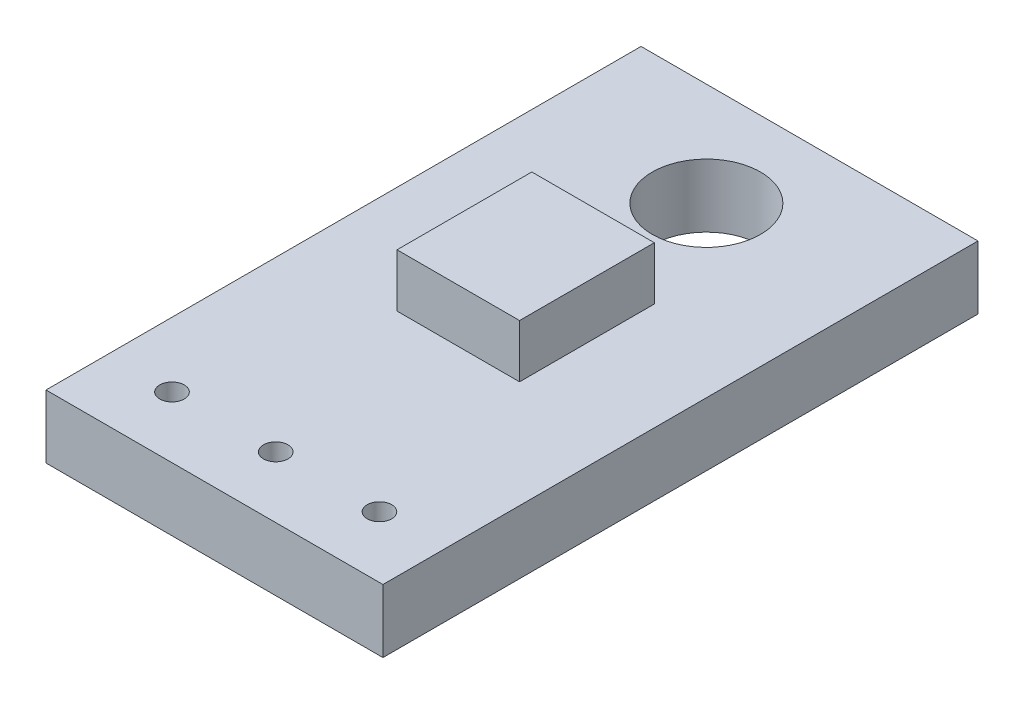
ISO-10303-21;
HEADER;
FILE_DESCRIPTION(('STEP AP214'),'2;1');
FILE_NAME('part.step','',(''),(''),'','','');
FILE_SCHEMA(('AUTOMOTIVE_DESIGN { 1 0 10303 214 1 1 1 1 }'));
ENDSEC;
DATA;
#1=APPLICATION_CONTEXT('core data for automotive mechanical design processes');
#2=APPLICATION_PROTOCOL_DEFINITION('international standard','automotive_design',2000,#1);
#3=PRODUCT_CONTEXT('',#1,'mechanical');
#4=PRODUCT('Part','Part','',(#3));
#5=PRODUCT_RELATED_PRODUCT_CATEGORY('part','',(#4));
#6=PRODUCT_DEFINITION_FORMATION('','',#4);
#7=PRODUCT_DEFINITION_CONTEXT('part definition',#1,'design');
#8=PRODUCT_DEFINITION('design','',#6,#7);
#9=PRODUCT_DEFINITION_SHAPE('','',#8);
#10=(LENGTH_UNIT() NAMED_UNIT(*) SI_UNIT(.MILLI.,.METRE.));
#11=(NAMED_UNIT(*) PLANE_ANGLE_UNIT() SI_UNIT($,.RADIAN.));
#12=(NAMED_UNIT(*) SI_UNIT($,.STERADIAN.) SOLID_ANGLE_UNIT());
#13=UNCERTAINTY_MEASURE_WITH_UNIT(LENGTH_MEASURE(1.E-05),#10,'distance_accuracy_value','');
#14=(GEOMETRIC_REPRESENTATION_CONTEXT(3) GLOBAL_UNCERTAINTY_ASSIGNED_CONTEXT((#13)) GLOBAL_UNIT_ASSIGNED_CONTEXT((#10,
#11,#12)) REPRESENTATION_CONTEXT('',''));
#15=CARTESIAN_POINT('',(0.,0.,0.));
#16=DIRECTION('',(0.,0.,1.));
#17=DIRECTION('',(1.,0.,0.));
#18=AXIS2_PLACEMENT_3D('',#15,#16,#17);
#19=CARTESIAN_POINT('',(0.,1.55,0.));
#20=DIRECTION('',(0.,-1.,0.));
#21=DIRECTION('',(0.,0.,-1.));
#22=AXIS2_PLACEMENT_3D('',#19,#20,#21);
#23=PLANE('',#22);
#24=CARTESIAN_POINT('',(4.125,1.55,-1.5));
#25=DIRECTION('',(0.,1.,0.));
#26=DIRECTION('',(0.,0.,1.));
#27=AXIS2_PLACEMENT_3D('',#24,#25,#26);
#28=CIRCLE('',#27,0.3);
#29=CARTESIAN_POINT('',(4.125,1.55,-1.2));
#30=VERTEX_POINT('',#29);
#31=EDGE_CURVE('E313',#30,#30,#28,.T.);
#32=ORIENTED_EDGE('',*,*,#31,.F.);
#33=EDGE_LOOP('',(#32));
#34=FACE_BOUND('',#33,.T.);
#35=CARTESIAN_POINT('',(1.585,1.55,-1.5));
#36=DIRECTION('',(0.,1.,0.));
#37=DIRECTION('',(0.,0.,1.));
#38=AXIS2_PLACEMENT_3D('',#35,#36,#37);
#39=CIRCLE('',#38,0.3);
#40=CARTESIAN_POINT('',(1.585,1.55,-1.2));
#41=VERTEX_POINT('',#40);
#42=EDGE_CURVE('E315',#41,#41,#39,.T.);
#43=ORIENTED_EDGE('',*,*,#42,.F.);
#44=EDGE_LOOP('',(#43));
#45=FACE_BOUND('',#44,.T.);
#46=CARTESIAN_POINT('',(6.665,1.55,-1.5));
#47=DIRECTION('',(0.,1.,0.));
#48=DIRECTION('',(0.,0.,1.));
#49=AXIS2_PLACEMENT_3D('',#46,#47,#48);
#50=CIRCLE('',#49,0.3);
#51=CARTESIAN_POINT('',(6.665,1.55,-1.2));
#52=VERTEX_POINT('',#51);
#53=EDGE_CURVE('E323',#52,#52,#50,.T.);
#54=ORIENTED_EDGE('',*,*,#53,.F.);
#55=EDGE_LOOP('',(#54));
#56=FACE_BOUND('',#55,.T.);
#57=DIRECTION('',(0.,0.,1.));
#58=VECTOR('',#57,1.);
#59=CARTESIAN_POINT('',(0.,1.55,0.));
#60=LINE('',#59,#58);
#61=CARTESIAN_POINT('',(0.,1.55,-14.57));
#62=VERTEX_POINT('',#61);
#63=CARTESIAN_POINT('',(0.,1.55,0.));
#64=VERTEX_POINT('',#63);
#65=EDGE_CURVE('E130',#62,#64,#60,.T.);
#66=ORIENTED_EDGE('',*,*,#65,.T.);
#67=DIRECTION('',(1.,0.,0.));
#68=VECTOR('',#67,1.);
#69=CARTESIAN_POINT('',(0.,1.55,0.));
#70=LINE('',#69,#68);
#71=CARTESIAN_POINT('',(8.25,1.55,0.));
#72=VERTEX_POINT('',#71);
#73=EDGE_CURVE('E133',#64,#72,#70,.T.);
#74=ORIENTED_EDGE('',*,*,#73,.T.);
#75=DIRECTION('',(0.,0.,-1.));
#76=VECTOR('',#75,1.);
#77=CARTESIAN_POINT('',(8.25,1.55,0.));
#78=LINE('',#77,#76);
#79=CARTESIAN_POINT('',(8.25,1.55,-14.57));
#80=VERTEX_POINT('',#79);
#81=EDGE_CURVE('E136',#72,#80,#78,.T.);
#82=ORIENTED_EDGE('',*,*,#81,.T.);
#83=DIRECTION('',(-1.,0.,0.));
#84=VECTOR('',#83,1.);
#85=CARTESIAN_POINT('',(0.,1.55,-14.57));
#86=LINE('',#85,#84);
#87=EDGE_CURVE('E138',#80,#62,#86,.T.);
#88=ORIENTED_EDGE('',*,*,#87,.T.);
#89=EDGE_LOOP('',(#66,#74,#82,#88));
#90=FACE_BOUND('',#89,.T.);
#91=CARTESIAN_POINT('',(4.125,1.55,-12.045));
#92=DIRECTION('',(0.,1.,0.));
#93=DIRECTION('',(0.,0.,1.));
#94=AXIS2_PLACEMENT_3D('',#91,#92,#93);
#95=CIRCLE('',#94,1.325);
#96=CARTESIAN_POINT('',(4.125,1.55,-10.72));
#97=VERTEX_POINT('',#96);
#98=EDGE_CURVE('E118',#97,#97,#95,.T.);
#99=ORIENTED_EDGE('',*,*,#98,.F.);
#100=EDGE_LOOP('',(#99));
#101=FACE_BOUND('',#100,.T.);
#102=DIRECTION('',(0.,0.,1.));
#103=VECTOR('',#102,1.);
#104=CARTESIAN_POINT('',(2.625,1.55,-9.27));
#105=LINE('',#104,#103);
#106=CARTESIAN_POINT('',(2.625,1.55,-9.27));
#107=VERTEX_POINT('',#106);
#108=CARTESIAN_POINT('',(2.625,1.55,-5.97));
#109=VERTEX_POINT('',#108);
#110=EDGE_CURVE('E117',#107,#109,#105,.T.);
#111=ORIENTED_EDGE('',*,*,#110,.F.);
#112=DIRECTION('',(-1.,0.,0.));
#113=VECTOR('',#112,1.);
#114=CARTESIAN_POINT('',(2.625,1.55,-9.27));
#115=LINE('',#114,#113);
#116=CARTESIAN_POINT('',(5.625,1.55,-9.27));
#117=VERTEX_POINT('',#116);
#118=EDGE_CURVE('E114',#117,#107,#115,.T.);
#119=ORIENTED_EDGE('',*,*,#118,.F.);
#120=DIRECTION('',(0.,0.,-1.));
#121=VECTOR('',#120,1.);
#122=CARTESIAN_POINT('',(5.625,1.55,-9.27));
#123=LINE('',#122,#121);
#124=CARTESIAN_POINT('',(5.625,1.55,-5.97));
#125=VERTEX_POINT('',#124);
#126=EDGE_CURVE('E52',#125,#117,#123,.T.);
#127=ORIENTED_EDGE('',*,*,#126,.F.);
#128=DIRECTION('',(1.,0.,0.));
#129=VECTOR('',#128,1.);
#130=CARTESIAN_POINT('',(2.625,1.55,-5.97));
#131=LINE('',#130,#129);
#132=EDGE_CURVE('E47',#109,#125,#131,.T.);
#133=ORIENTED_EDGE('',*,*,#132,.F.);
#134=EDGE_LOOP('',(#111,#119,#127,#133));
#135=FACE_BOUND('',#134,.T.);
#136=ADVANCED_FACE('F32',(#34,#45,#56,#90,#101,#135),#23,.F.);
#137=CARTESIAN_POINT('',(0.,1.55,0.));
#138=DIRECTION('',(1.,0.,0.));
#139=DIRECTION('',(0.,0.,-1.));
#140=AXIS2_PLACEMENT_3D('',#137,#138,#139);
#141=PLANE('',#140);
#142=DIRECTION('',(0.,0.,1.));
#143=VECTOR('',#142,1.);
#144=CARTESIAN_POINT('',(0.,0.,0.));
#145=LINE('',#144,#143);
#146=CARTESIAN_POINT('',(0.,0.,-14.57));
#147=VERTEX_POINT('',#146);
#148=CARTESIAN_POINT('',(0.,0.,0.));
#149=VERTEX_POINT('',#148);
#150=EDGE_CURVE('E128',#147,#149,#145,.T.);
#151=ORIENTED_EDGE('',*,*,#150,.T.);
#152=DIRECTION('',(0.,-1.,0.));
#153=VECTOR('',#152,1.);
#154=CARTESIAN_POINT('',(0.,1.55,0.));
#155=LINE('',#154,#153);
#156=EDGE_CURVE('E11',#64,#149,#155,.T.);
#157=ORIENTED_EDGE('',*,*,#156,.F.);
#158=ORIENTED_EDGE('',*,*,#65,.F.);
#159=DIRECTION('',(0.,-1.,0.));
#160=VECTOR('',#159,1.);
#161=CARTESIAN_POINT('',(0.,1.55,-14.57));
#162=LINE('',#161,#160);
#163=EDGE_CURVE('E140',#62,#147,#162,.T.);
#164=ORIENTED_EDGE('',*,*,#163,.T.);
#165=EDGE_LOOP('',(#151,#157,#158,#164));
#166=FACE_BOUND('',#165,.T.);
#167=ADVANCED_FACE('F34',(#166),#141,.F.);
#168=CARTESIAN_POINT('',(0.,1.55,0.));
#169=DIRECTION('',(0.,0.,-1.));
#170=DIRECTION('',(-1.,0.,0.));
#171=AXIS2_PLACEMENT_3D('',#168,#169,#170);
#172=PLANE('',#171);
#173=DIRECTION('',(1.,0.,0.));
#174=VECTOR('',#173,1.);
#175=CARTESIAN_POINT('',(0.,0.,0.));
#176=LINE('',#175,#174);
#177=CARTESIAN_POINT('',(8.25,0.,0.));
#178=VERTEX_POINT('',#177);
#179=EDGE_CURVE('E143',#149,#178,#176,.T.);
#180=ORIENTED_EDGE('',*,*,#179,.T.);
#181=DIRECTION('',(0.,-1.,0.));
#182=VECTOR('',#181,1.);
#183=CARTESIAN_POINT('',(8.25,1.55,0.));
#184=LINE('',#183,#182);
#185=EDGE_CURVE('E40',#72,#178,#184,.T.);
#186=ORIENTED_EDGE('',*,*,#185,.F.);
#187=ORIENTED_EDGE('',*,*,#73,.F.);
#188=ORIENTED_EDGE('',*,*,#156,.T.);
#189=EDGE_LOOP('',(#180,#186,#187,#188));
#190=FACE_BOUND('',#189,.T.);
#191=ADVANCED_FACE('F173',(#190),#172,.F.);
#192=CARTESIAN_POINT('',(8.25,1.55,0.));
#193=DIRECTION('',(-1.,0.,0.));
#194=DIRECTION('',(0.,0.,1.));
#195=AXIS2_PLACEMENT_3D('',#192,#193,#194);
#196=PLANE('',#195);
#197=DIRECTION('',(0.,0.,-1.));
#198=VECTOR('',#197,1.);
#199=CARTESIAN_POINT('',(8.25,0.,0.));
#200=LINE('',#199,#198);
#201=CARTESIAN_POINT('',(8.25,0.,-14.57));
#202=VERTEX_POINT('',#201);
#203=EDGE_CURVE('E145',#178,#202,#200,.T.);
#204=ORIENTED_EDGE('',*,*,#203,.T.);
#205=DIRECTION('',(0.,-1.,0.));
#206=VECTOR('',#205,1.);
#207=CARTESIAN_POINT('',(8.25,1.55,-14.57));
#208=LINE('',#207,#206);
#209=EDGE_CURVE('E150',#80,#202,#208,.T.);
#210=ORIENTED_EDGE('',*,*,#209,.F.);
#211=ORIENTED_EDGE('',*,*,#81,.F.);
#212=ORIENTED_EDGE('',*,*,#185,.T.);
#213=EDGE_LOOP('',(#204,#210,#211,#212));
#214=FACE_BOUND('',#213,.T.);
#215=ADVANCED_FACE('F157',(#214),#196,.F.);
#216=CARTESIAN_POINT('',(0.,1.55,-14.57));
#217=DIRECTION('',(0.,0.,1.));
#218=DIRECTION('',(1.,0.,0.));
#219=AXIS2_PLACEMENT_3D('',#216,#217,#218);
#220=PLANE('',#219);
#221=DIRECTION('',(-1.,0.,0.));
#222=VECTOR('',#221,1.);
#223=CARTESIAN_POINT('',(0.,0.,-14.57));
#224=LINE('',#223,#222);
#225=EDGE_CURVE('E134',#202,#147,#224,.T.);
#226=ORIENTED_EDGE('',*,*,#225,.T.);
#227=ORIENTED_EDGE('',*,*,#163,.F.);
#228=ORIENTED_EDGE('',*,*,#87,.F.);
#229=ORIENTED_EDGE('',*,*,#209,.T.);
#230=EDGE_LOOP('',(#226,#227,#228,#229));
#231=FACE_BOUND('',#230,.T.);
#232=ADVANCED_FACE('F166',(#231),#220,.F.);
#233=CARTESIAN_POINT('',(0.,0.,0.));
#234=DIRECTION('',(0.,-1.,0.));
#235=DIRECTION('',(0.,0.,-1.));
#236=AXIS2_PLACEMENT_3D('',#233,#234,#235);
#237=PLANE('',#236);
#238=CARTESIAN_POINT('',(4.125,0.,-1.5));
#239=DIRECTION('',(0.,-1.,0.));
#240=DIRECTION('',(0.,0.,-1.));
#241=AXIS2_PLACEMENT_3D('',#238,#239,#240);
#242=CIRCLE('',#241,0.299999999999999);
#243=CARTESIAN_POINT('',(4.125,0.,-1.8));
#244=VERTEX_POINT('',#243);
#245=EDGE_CURVE('E311',#244,#244,#242,.T.);
#246=ORIENTED_EDGE('',*,*,#245,.F.);
#247=EDGE_LOOP('',(#246));
#248=FACE_BOUND('',#247,.T.);
#249=CARTESIAN_POINT('',(1.585,0.,-1.5));
#250=DIRECTION('',(0.,-1.,0.));
#251=DIRECTION('',(0.,0.,-1.));
#252=AXIS2_PLACEMENT_3D('',#249,#250,#251);
#253=CIRCLE('',#252,0.3);
#254=CARTESIAN_POINT('',(1.585,0.,-1.8));
#255=VERTEX_POINT('',#254);
#256=EDGE_CURVE('E320',#255,#255,#253,.T.);
#257=ORIENTED_EDGE('',*,*,#256,.F.);
#258=EDGE_LOOP('',(#257));
#259=FACE_BOUND('',#258,.T.);
#260=CARTESIAN_POINT('',(6.665,0.,-1.5));
#261=DIRECTION('',(0.,-1.,0.));
#262=DIRECTION('',(0.,0.,-1.));
#263=AXIS2_PLACEMENT_3D('',#260,#261,#262);
#264=CIRCLE('',#263,0.3);
#265=CARTESIAN_POINT('',(6.665,0.,-1.8));
#266=VERTEX_POINT('',#265);
#267=EDGE_CURVE('E326',#266,#266,#264,.T.);
#268=ORIENTED_EDGE('',*,*,#267,.F.);
#269=EDGE_LOOP('',(#268));
#270=FACE_BOUND('',#269,.T.);
#271=CARTESIAN_POINT('',(4.125,0.,-12.045));
#272=DIRECTION('',(0.,1.,0.));
#273=DIRECTION('',(0.,0.,1.));
#274=AXIS2_PLACEMENT_3D('',#271,#272,#273);
#275=CIRCLE('',#274,1.325);
#276=CARTESIAN_POINT('',(4.125,0.,-10.72));
#277=VERTEX_POINT('',#276);
#278=EDGE_CURVE('E121',#277,#277,#275,.T.);
#279=ORIENTED_EDGE('',*,*,#278,.T.);
#280=EDGE_LOOP('',(#279));
#281=FACE_BOUND('',#280,.T.);
#282=ORIENTED_EDGE('',*,*,#150,.F.);
#283=ORIENTED_EDGE('',*,*,#225,.F.);
#284=ORIENTED_EDGE('',*,*,#203,.F.);
#285=ORIENTED_EDGE('',*,*,#179,.F.);
#286=EDGE_LOOP('',(#282,#283,#284,#285));
#287=FACE_BOUND('',#286,.T.);
#288=ADVANCED_FACE('F163',(#248,#259,#270,#281,#287),#237,.T.);
#289=CARTESIAN_POINT('',(4.125,0.,-12.045));
#290=DIRECTION('',(0.,1.,0.));
#291=DIRECTION('',(0.,0.,1.));
#292=AXIS2_PLACEMENT_3D('',#289,#290,#291);
#293=CYLINDRICAL_SURFACE('',#292,1.325);
#294=CARTESIAN_POINT('',(4.125,0.,-10.72));
#295=CARTESIAN_POINT('',(4.125,0.0161458333333333,-10.72));
#296=CARTESIAN_POINT('',(4.125,0.0322916666666667,-10.72));
#297=CARTESIAN_POINT('',(4.125,0.0645833333333333,-10.72));
#298=CARTESIAN_POINT('',(4.125,0.0807291666666667,-10.72));
#299=CARTESIAN_POINT('',(4.125,0.113020833333333,-10.72));
#300=CARTESIAN_POINT('',(4.125,0.129166666666667,-10.72));
#301=CARTESIAN_POINT('',(4.125,0.161458333333333,-10.72));
#302=CARTESIAN_POINT('',(4.125,0.177604166666667,-10.72));
#303=CARTESIAN_POINT('',(4.125,0.209895833333333,-10.72));
#304=CARTESIAN_POINT('',(4.125,0.226041666666667,-10.72));
#305=CARTESIAN_POINT('',(4.125,0.258333333333333,-10.72));
#306=CARTESIAN_POINT('',(4.125,0.274479166666667,-10.72));
#307=CARTESIAN_POINT('',(4.125,0.306770833333333,-10.72));
#308=CARTESIAN_POINT('',(4.125,0.322916666666667,-10.72));
#309=CARTESIAN_POINT('',(4.125,0.355208333333333,-10.72));
#310=CARTESIAN_POINT('',(4.125,0.371354166666667,-10.72));
#311=CARTESIAN_POINT('',(4.125,0.403645833333333,-10.72));
#312=CARTESIAN_POINT('',(4.125,0.419791666666667,-10.72));
#313=CARTESIAN_POINT('',(4.125,0.452083333333333,-10.72));
#314=CARTESIAN_POINT('',(4.125,0.468229166666667,-10.72));
#315=CARTESIAN_POINT('',(4.125,0.500520833333333,-10.72));
#316=CARTESIAN_POINT('',(4.125,0.516666666666667,-10.72));
#317=CARTESIAN_POINT('',(4.125,0.548958333333333,-10.72));
#318=CARTESIAN_POINT('',(4.125,0.565104166666667,-10.72));
#319=CARTESIAN_POINT('',(4.125,0.597395833333333,-10.72));
#320=CARTESIAN_POINT('',(4.125,0.613541666666667,-10.72));
#321=CARTESIAN_POINT('',(4.125,0.645833333333333,-10.72));
#322=CARTESIAN_POINT('',(4.125,0.661979166666667,-10.72));
#323=CARTESIAN_POINT('',(4.125,0.694270833333333,-10.72));
#324=CARTESIAN_POINT('',(4.125,0.710416666666667,-10.72));
#325=CARTESIAN_POINT('',(4.125,0.742708333333333,-10.72));
#326=CARTESIAN_POINT('',(4.125,0.758854166666667,-10.72));
#327=CARTESIAN_POINT('',(4.125,0.791145833333333,-10.72));
#328=CARTESIAN_POINT('',(4.125,0.807291666666667,-10.72));
#329=CARTESIAN_POINT('',(4.125,0.839583333333333,-10.72));
#330=CARTESIAN_POINT('',(4.125,0.855729166666667,-10.72));
#331=CARTESIAN_POINT('',(4.125,0.888020833333333,-10.72));
#332=CARTESIAN_POINT('',(4.125,0.904166666666667,-10.72));
#333=CARTESIAN_POINT('',(4.125,0.936458333333333,-10.72));
#334=CARTESIAN_POINT('',(4.125,0.952604166666667,-10.72));
#335=CARTESIAN_POINT('',(4.125,0.984895833333333,-10.72));
#336=CARTESIAN_POINT('',(4.125,1.00104166666667,-10.72));
#337=CARTESIAN_POINT('',(4.125,1.03333333333333,-10.72));
#338=CARTESIAN_POINT('',(4.125,1.04947916666667,-10.72));
#339=CARTESIAN_POINT('',(4.125,1.08177083333333,-10.72));
#340=CARTESIAN_POINT('',(4.125,1.09791666666667,-10.72));
#341=CARTESIAN_POINT('',(4.125,1.13020833333333,-10.72));
#342=CARTESIAN_POINT('',(4.125,1.14635416666667,-10.72));
#343=CARTESIAN_POINT('',(4.125,1.17864583333333,-10.72));
#344=CARTESIAN_POINT('',(4.125,1.19479166666667,-10.72));
#345=CARTESIAN_POINT('',(4.125,1.22708333333333,-10.72));
#346=CARTESIAN_POINT('',(4.125,1.24322916666667,-10.72));
#347=CARTESIAN_POINT('',(4.125,1.27552083333333,-10.72));
#348=CARTESIAN_POINT('',(4.125,1.29166666666667,-10.72));
#349=CARTESIAN_POINT('',(4.125,1.32395833333333,-10.72));
#350=CARTESIAN_POINT('',(4.125,1.34010416666667,-10.72));
#351=CARTESIAN_POINT('',(4.125,1.37239583333333,-10.72));
#352=CARTESIAN_POINT('',(4.125,1.38854166666667,-10.72));
#353=CARTESIAN_POINT('',(4.125,1.42083333333333,-10.72));
#354=CARTESIAN_POINT('',(4.125,1.43697916666667,-10.72));
#355=CARTESIAN_POINT('',(4.125,1.46927083333333,-10.72));
#356=CARTESIAN_POINT('',(4.125,1.48541666666667,-10.72));
#357=CARTESIAN_POINT('',(4.125,1.51770833333333,-10.72));
#358=CARTESIAN_POINT('',(4.125,1.53385416666667,-10.72));
#359=CARTESIAN_POINT('',(4.125,1.55,-10.72));
#360=B_SPLINE_CURVE_WITH_KNOTS('',3,(#294,#295,#296,#297,#298,#299,#300,#301,#302,#303,#304,
#305,#306,#307,#308,#309,#310,#311,#312,#313,#314,#315,#316,#317,#318,#319,#320,#321,#322,#323,
#324,#325,#326,#327,#328,#329,#330,#331,#332,#333,#334,#335,#336,#337,#338,#339,#340,#341,#342,
#343,#344,#345,#346,#347,#348,#349,#350,#351,#352,#353,#354,#355,#356,#357,#358,#359),
.UNSPECIFIED.,.F.,.F.,(4,2,2,2,2,2,2,2,2,2,2,2,2,2,2,2,2,2,2,2,2,2,2,2,2,2,2,2,2,2,2,2,4),(0.,
0.0484375,0.096875,0.1453125,0.19375,0.2421875,0.290625,0.3390625,0.3875,0.4359375,0.484375,
0.5328125,0.58125,0.6296875,0.678125,0.7265625,0.775,0.8234375,0.871875,0.9203125,0.96875,
1.0171875,1.065625,1.1140625,1.1625,1.2109375,1.259375,1.3078125,1.35625,1.4046875,1.453125,
1.5015625,1.55),.UNSPECIFIED.);
#361=EDGE_CURVE('BSEAM189',#277,#97,#360,.T.);
#362=ORIENTED_EDGE('',*,*,#278,.F.);
#363=ORIENTED_EDGE('',*,*,#98,.T.);
#364=ORIENTED_EDGE('',*,*,#361,.T.);
#365=ORIENTED_EDGE('',*,*,#361,.F.);
#366=EDGE_LOOP('',(#362,#364,#363,#365));
#367=FACE_BOUND('',#366,.T.);
#368=ADVANCED_FACE('F189',(#367),#293,.F.);
#369=CARTESIAN_POINT('',(2.625,2.85,-9.27));
#370=DIRECTION('',(1.,0.,0.));
#371=DIRECTION('',(0.,0.,-1.));
#372=AXIS2_PLACEMENT_3D('',#369,#370,#371);
#373=PLANE('',#372);
#374=ORIENTED_EDGE('',*,*,#110,.T.);
#375=DIRECTION('',(0.,-1.,0.));
#376=VECTOR('',#375,1.);
#377=CARTESIAN_POINT('',(2.625,2.85,-5.97));
#378=LINE('',#377,#376);
#379=CARTESIAN_POINT('',(2.625,2.85,-5.97));
#380=VERTEX_POINT('',#379);
#381=EDGE_CURVE('E98',#380,#109,#378,.T.);
#382=ORIENTED_EDGE('',*,*,#381,.F.);
#383=DIRECTION('',(0.,0.,1.));
#384=VECTOR('',#383,1.);
#385=CARTESIAN_POINT('',(2.625,2.85,-9.27));
#386=LINE('',#385,#384);
#387=CARTESIAN_POINT('',(2.625,2.85,-9.27));
#388=VERTEX_POINT('',#387);
#389=EDGE_CURVE('E105',#388,#380,#386,.T.);
#390=ORIENTED_EDGE('',*,*,#389,.F.);
#391=DIRECTION('',(0.,-1.,0.));
#392=VECTOR('',#391,1.);
#393=CARTESIAN_POINT('',(2.625,2.85,-9.27));
#394=LINE('',#393,#392);
#395=EDGE_CURVE('E331',#388,#107,#394,.T.);
#396=ORIENTED_EDGE('',*,*,#395,.T.);
#397=EDGE_LOOP('',(#374,#382,#390,#396));
#398=FACE_BOUND('',#397,.T.);
#399=ADVANCED_FACE('F116',(#398),#373,.F.);
#400=CARTESIAN_POINT('',(2.625,2.85,-5.97));
#401=DIRECTION('',(0.,0.,-1.));
#402=DIRECTION('',(-1.,0.,0.));
#403=AXIS2_PLACEMENT_3D('',#400,#401,#402);
#404=PLANE('',#403);
#405=ORIENTED_EDGE('',*,*,#132,.T.);
#406=DIRECTION('',(0.,-1.,0.));
#407=VECTOR('',#406,1.);
#408=CARTESIAN_POINT('',(5.625,2.85,-5.97));
#409=LINE('',#408,#407);
#410=CARTESIAN_POINT('',(5.625,2.85,-5.97));
#411=VERTEX_POINT('',#410);
#412=EDGE_CURVE('E101',#411,#125,#409,.T.);
#413=ORIENTED_EDGE('',*,*,#412,.F.);
#414=DIRECTION('',(1.,0.,0.));
#415=VECTOR('',#414,1.);
#416=CARTESIAN_POINT('',(2.625,2.85,-5.97));
#417=LINE('',#416,#415);
#418=EDGE_CURVE('E94',#380,#411,#417,.T.);
#419=ORIENTED_EDGE('',*,*,#418,.F.);
#420=ORIENTED_EDGE('',*,*,#381,.T.);
#421=EDGE_LOOP('',(#405,#413,#419,#420));
#422=FACE_BOUND('',#421,.T.);
#423=ADVANCED_FACE('F96',(#422),#404,.F.);
#424=CARTESIAN_POINT('',(5.625,2.85,-9.27));
#425=DIRECTION('',(-1.,0.,0.));
#426=DIRECTION('',(0.,0.,1.));
#427=AXIS2_PLACEMENT_3D('',#424,#425,#426);
#428=PLANE('',#427);
#429=ORIENTED_EDGE('',*,*,#126,.T.);
#430=DIRECTION('',(0.,-1.,0.));
#431=VECTOR('',#430,1.);
#432=CARTESIAN_POINT('',(5.625,2.85,-9.27));
#433=LINE('',#432,#431);
#434=CARTESIAN_POINT('',(5.625,2.85,-9.27));
#435=VERTEX_POINT('',#434);
#436=EDGE_CURVE('E123',#435,#117,#433,.T.);
#437=ORIENTED_EDGE('',*,*,#436,.F.);
#438=DIRECTION('',(0.,0.,-1.));
#439=VECTOR('',#438,1.);
#440=CARTESIAN_POINT('',(5.625,2.85,-9.27));
#441=LINE('',#440,#439);
#442=EDGE_CURVE('E104',#411,#435,#441,.T.);
#443=ORIENTED_EDGE('',*,*,#442,.F.);
#444=ORIENTED_EDGE('',*,*,#412,.T.);
#445=EDGE_LOOP('',(#429,#437,#443,#444));
#446=FACE_BOUND('',#445,.T.);
#447=ADVANCED_FACE('F221',(#446),#428,.F.);
#448=CARTESIAN_POINT('',(2.625,2.85,-9.27));
#449=DIRECTION('',(0.,0.,1.));
#450=DIRECTION('',(1.,0.,0.));
#451=AXIS2_PLACEMENT_3D('',#448,#449,#450);
#452=PLANE('',#451);
#453=ORIENTED_EDGE('',*,*,#118,.T.);
#454=ORIENTED_EDGE('',*,*,#395,.F.);
#455=DIRECTION('',(-1.,0.,0.));
#456=VECTOR('',#455,1.);
#457=CARTESIAN_POINT('',(2.625,2.85,-9.27));
#458=LINE('',#457,#456);
#459=EDGE_CURVE('E110',#435,#388,#458,.T.);
#460=ORIENTED_EDGE('',*,*,#459,.F.);
#461=ORIENTED_EDGE('',*,*,#436,.T.);
#462=EDGE_LOOP('',(#453,#454,#460,#461));
#463=FACE_BOUND('',#462,.T.);
#464=ADVANCED_FACE('F228',(#463),#452,.F.);
#465=CARTESIAN_POINT('',(0.,2.85,0.));
#466=DIRECTION('',(0.,1.,0.));
#467=DIRECTION('',(0.,0.,1.));
#468=AXIS2_PLACEMENT_3D('',#465,#466,#467);
#469=PLANE('',#468);
#470=ORIENTED_EDGE('',*,*,#389,.T.);
#471=ORIENTED_EDGE('',*,*,#418,.T.);
#472=ORIENTED_EDGE('',*,*,#442,.T.);
#473=ORIENTED_EDGE('',*,*,#459,.T.);
#474=EDGE_LOOP('',(#470,#471,#472,#473));
#475=FACE_BOUND('',#474,.T.);
#476=ADVANCED_FACE('F108',(#475),#469,.T.);
#477=CARTESIAN_POINT('',(6.665,1.55,-1.5));
#478=DIRECTION('',(0.,1.,0.));
#479=DIRECTION('',(0.,0.,1.));
#480=AXIS2_PLACEMENT_3D('',#477,#478,#479);
#481=CYLINDRICAL_SURFACE('',#480,0.3);
#482=ORIENTED_EDGE('',*,*,#267,.T.);
#483=EDGE_LOOP('',(#482));
#484=FACE_BOUND('',#483,.T.);
#485=ORIENTED_EDGE('',*,*,#53,.T.);
#486=EDGE_LOOP('',(#485));
#487=FACE_BOUND('',#486,.T.);
#488=ADVANCED_FACE('F243',(#484,#487),#481,.F.);
#489=CARTESIAN_POINT('',(1.585,1.55,-1.5));
#490=DIRECTION('',(0.,1.,0.));
#491=DIRECTION('',(0.,0.,1.));
#492=AXIS2_PLACEMENT_3D('',#489,#490,#491);
#493=CYLINDRICAL_SURFACE('',#492,0.3);
#494=ORIENTED_EDGE('',*,*,#256,.T.);
#495=EDGE_LOOP('',(#494));
#496=FACE_BOUND('',#495,.T.);
#497=ORIENTED_EDGE('',*,*,#42,.T.);
#498=EDGE_LOOP('',(#497));
#499=FACE_BOUND('',#498,.T.);
#500=ADVANCED_FACE('F249',(#496,#499),#493,.F.);
#501=CARTESIAN_POINT('',(4.125,1.55,-1.5));
#502=DIRECTION('',(0.,1.,0.));
#503=DIRECTION('',(0.,0.,1.));
#504=AXIS2_PLACEMENT_3D('',#501,#502,#503);
#505=CYLINDRICAL_SURFACE('',#504,0.299999999999999);
#506=ORIENTED_EDGE('',*,*,#245,.T.);
#507=EDGE_LOOP('',(#506));
#508=FACE_BOUND('',#507,.T.);
#509=ORIENTED_EDGE('',*,*,#31,.T.);
#510=EDGE_LOOP('',(#509));
#511=FACE_BOUND('',#510,.T.);
#512=ADVANCED_FACE('F257',(#508,#511),#505,.F.);
#513=CLOSED_SHELL('',(#136,#167,#191,#215,#232,#288,#368,#399,#423,#447,#464,#476,#488,#500,#512));
#514=MANIFOLD_SOLID_BREP('B2',#513);
#515=ADVANCED_BREP_SHAPE_REPRESENTATION('',(#18,#514),#14);
#516=SHAPE_DEFINITION_REPRESENTATION(#9,#515);
ENDSEC;
END-ISO-10303-21;
